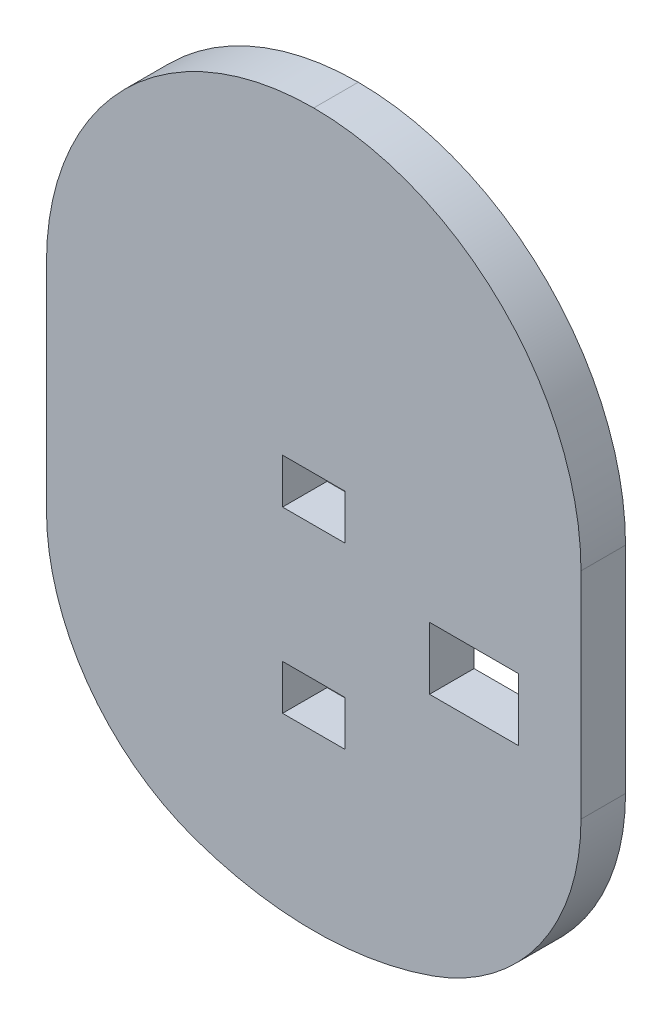
ISO-10303-21;
HEADER;
FILE_DESCRIPTION(('STEP AP214'),'2;1');
FILE_NAME('part.step','',(''),(''),'','','');
FILE_SCHEMA(('AUTOMOTIVE_DESIGN { 1 0 10303 214 1 1 1 1 }'));
ENDSEC;
DATA;
#1=APPLICATION_CONTEXT('core data for automotive mechanical design processes');
#2=APPLICATION_PROTOCOL_DEFINITION('international standard','automotive_design',2000,#1);
#3=PRODUCT_CONTEXT('',#1,'mechanical');
#4=PRODUCT('Part','Part','',(#3));
#5=PRODUCT_RELATED_PRODUCT_CATEGORY('part','',(#4));
#6=PRODUCT_DEFINITION_FORMATION('','',#4);
#7=PRODUCT_DEFINITION_CONTEXT('part definition',#1,'design');
#8=PRODUCT_DEFINITION('design','',#6,#7);
#9=PRODUCT_DEFINITION_SHAPE('','',#8);
#10=(LENGTH_UNIT() NAMED_UNIT(*) SI_UNIT(.MILLI.,.METRE.));
#11=(NAMED_UNIT(*) PLANE_ANGLE_UNIT() SI_UNIT($,.RADIAN.));
#12=(NAMED_UNIT(*) SI_UNIT($,.STERADIAN.) SOLID_ANGLE_UNIT());
#13=UNCERTAINTY_MEASURE_WITH_UNIT(LENGTH_MEASURE(1.E-05),#10,'distance_accuracy_value','');
#14=(GEOMETRIC_REPRESENTATION_CONTEXT(3) GLOBAL_UNCERTAINTY_ASSIGNED_CONTEXT((#13)) GLOBAL_UNIT_ASSIGNED_CONTEXT((#10,
#11,#12)) REPRESENTATION_CONTEXT('',''));
#15=CARTESIAN_POINT('',(0.,0.,0.));
#16=DIRECTION('',(0.,0.,1.));
#17=DIRECTION('',(1.,0.,0.));
#18=AXIS2_PLACEMENT_3D('',#15,#16,#17);
#19=CARTESIAN_POINT('',(0.,0.,5.));
#20=DIRECTION('',(0.,0.,-1.));
#21=DIRECTION('',(-1.,0.,0.));
#22=AXIS2_PLACEMENT_3D('',#19,#20,#21);
#23=CYLINDRICAL_SURFACE('',#22,40.);
#24=CARTESIAN_POINT('',(0.,0.,5.));
#25=DIRECTION('',(0.,0.,1.));
#26=DIRECTION('',(1.,0.,0.));
#27=AXIS2_PLACEMENT_3D('',#24,#25,#26);
#28=CIRCLE('',#27,40.);
#29=CARTESIAN_POINT('',(-13.3333333333333,-37.7123616632825,5.));
#30=VERTEX_POINT('',#29);
#31=CARTESIAN_POINT('',(13.3333333333333,-37.7123616632825,5.));
#32=VERTEX_POINT('',#31);
#33=EDGE_CURVE('E248',#30,#32,#28,.T.);
#34=ORIENTED_EDGE('',*,*,#33,.F.);
#35=DIRECTION('',(0.,0.,-1.));
#36=VECTOR('',#35,1.);
#37=CARTESIAN_POINT('',(-13.3333333333333,-37.7123616632825,5.));
#38=LINE('',#37,#36);
#39=CARTESIAN_POINT('',(-13.3333333333333,-37.7123616632825,0.));
#40=VERTEX_POINT('',#39);
#41=EDGE_CURVE('E284',#30,#40,#38,.T.);
#42=ORIENTED_EDGE('',*,*,#41,.T.);
#43=CARTESIAN_POINT('',(0.,0.,0.));
#44=DIRECTION('',(0.,0.,1.));
#45=DIRECTION('',(1.,0.,0.));
#46=AXIS2_PLACEMENT_3D('',#43,#44,#45);
#47=CIRCLE('',#46,40.);
#48=CARTESIAN_POINT('',(13.3333333333333,-37.7123616632825,0.));
#49=VERTEX_POINT('',#48);
#50=EDGE_CURVE('E244',#40,#49,#47,.T.);
#51=ORIENTED_EDGE('',*,*,#50,.T.);
#52=DIRECTION('',(0.,0.,-1.));
#53=VECTOR('',#52,1.);
#54=CARTESIAN_POINT('',(13.3333333333333,-37.7123616632825,5.));
#55=LINE('',#54,#53);
#56=EDGE_CURVE('E281',#49,#32,#55,.F.);
#57=ORIENTED_EDGE('',*,*,#56,.T.);
#58=EDGE_LOOP('',(#34,#42,#51,#57));
#59=FACE_BOUND('',#58,.T.);
#60=ADVANCED_FACE('F35',(#59),#23,.T.);
#61=CARTESIAN_POINT('',(0.,0.,5.));
#62=DIRECTION('',(0.,0.,1.));
#63=DIRECTION('',(1.,0.,0.));
#64=AXIS2_PLACEMENT_3D('',#61,#62,#63);
#65=PLANE('',#64);
#66=DIRECTION('',(0.,1.,0.));
#67=VECTOR('',#66,1.);
#68=CARTESIAN_POINT('',(23.,0.,5.));
#69=LINE('',#68,#67);
#70=CARTESIAN_POINT('',(23.,-10.5,5.));
#71=VERTEX_POINT('',#70);
#72=CARTESIAN_POINT('',(23.,-3.5,5.));
#73=VERTEX_POINT('',#72);
#74=EDGE_CURVE('E199',#71,#73,#69,.T.);
#75=ORIENTED_EDGE('',*,*,#74,.F.);
#76=DIRECTION('',(1.,0.,0.));
#77=VECTOR('',#76,1.);
#78=CARTESIAN_POINT('',(0.,-10.5,5.));
#79=LINE('',#78,#77);
#80=CARTESIAN_POINT('',(13.,-10.5,5.));
#81=VERTEX_POINT('',#80);
#82=EDGE_CURVE('E192',#81,#71,#79,.T.);
#83=ORIENTED_EDGE('',*,*,#82,.F.);
#84=DIRECTION('',(0.,-1.,0.));
#85=VECTOR('',#84,1.);
#86=CARTESIAN_POINT('',(13.,0.,5.));
#87=LINE('',#86,#85);
#88=CARTESIAN_POINT('',(13.,-3.5,5.));
#89=VERTEX_POINT('',#88);
#90=EDGE_CURVE('E172',#89,#81,#87,.T.);
#91=ORIENTED_EDGE('',*,*,#90,.F.);
#92=DIRECTION('',(-1.,0.,0.));
#93=VECTOR('',#92,1.);
#94=CARTESIAN_POINT('',(0.,-3.5,5.));
#95=LINE('',#94,#93);
#96=EDGE_CURVE('E197',#73,#89,#95,.T.);
#97=ORIENTED_EDGE('',*,*,#96,.F.);
#98=EDGE_LOOP('',(#75,#83,#91,#97));
#99=FACE_BOUND('',#98,.T.);
#100=DIRECTION('',(0.,1.,0.));
#101=VECTOR('',#100,1.);
#102=CARTESIAN_POINT('',(3.5,4.5,5.));
#103=LINE('',#102,#101);
#104=CARTESIAN_POINT('',(3.5,-0.549999999999996,5.));
#105=VERTEX_POINT('',#104);
#106=CARTESIAN_POINT('',(3.5,4.5,5.));
#107=VERTEX_POINT('',#106);
#108=EDGE_CURVE('E202',#105,#107,#103,.T.);
#109=ORIENTED_EDGE('',*,*,#108,.F.);
#110=DIRECTION('',(1.,0.,0.));
#111=VECTOR('',#110,1.);
#112=CARTESIAN_POINT('',(-3.5,-0.549999999999996,5.));
#113=LINE('',#112,#111);
#114=CARTESIAN_POINT('',(-3.5,-0.549999999999996,5.));
#115=VERTEX_POINT('',#114);
#116=EDGE_CURVE('E211',#115,#105,#113,.T.);
#117=ORIENTED_EDGE('',*,*,#116,.F.);
#118=DIRECTION('',(0.,-1.,0.));
#119=VECTOR('',#118,1.);
#120=CARTESIAN_POINT('',(-3.5,4.5,5.));
#121=LINE('',#120,#119);
#122=CARTESIAN_POINT('',(-3.5,4.5,5.));
#123=VERTEX_POINT('',#122);
#124=EDGE_CURVE('E208',#123,#115,#121,.T.);
#125=ORIENTED_EDGE('',*,*,#124,.F.);
#126=DIRECTION('',(-1.,0.,0.));
#127=VECTOR('',#126,1.);
#128=CARTESIAN_POINT('',(-3.5,4.5,5.));
#129=LINE('',#128,#127);
#130=EDGE_CURVE('E204',#107,#123,#129,.T.);
#131=ORIENTED_EDGE('',*,*,#130,.F.);
#132=EDGE_LOOP('',(#109,#117,#125,#131));
#133=FACE_BOUND('',#132,.T.);
#134=DIRECTION('',(0.,1.,0.));
#135=VECTOR('',#134,1.);
#136=CARTESIAN_POINT('',(3.5,-15.55,5.));
#137=LINE('',#136,#135);
#138=CARTESIAN_POINT('',(3.5,-20.6,5.));
#139=VERTEX_POINT('',#138);
#140=CARTESIAN_POINT('',(3.5,-15.55,5.));
#141=VERTEX_POINT('',#140);
#142=EDGE_CURVE('E201',#139,#141,#137,.T.);
#143=ORIENTED_EDGE('',*,*,#142,.F.);
#144=DIRECTION('',(1.,0.,0.));
#145=VECTOR('',#144,1.);
#146=CARTESIAN_POINT('',(-3.5,-20.6,5.));
#147=LINE('',#146,#145);
#148=CARTESIAN_POINT('',(-3.5,-20.6,5.));
#149=VERTEX_POINT('',#148);
#150=EDGE_CURVE('E231',#149,#139,#147,.T.);
#151=ORIENTED_EDGE('',*,*,#150,.F.);
#152=DIRECTION('',(0.,-1.,0.));
#153=VECTOR('',#152,1.);
#154=CARTESIAN_POINT('',(-3.5,-15.55,5.));
#155=LINE('',#154,#153);
#156=CARTESIAN_POINT('',(-3.5,-15.55,5.));
#157=VERTEX_POINT('',#156);
#158=EDGE_CURVE('E228',#157,#149,#155,.T.);
#159=ORIENTED_EDGE('',*,*,#158,.F.);
#160=DIRECTION('',(-1.,0.,0.));
#161=VECTOR('',#160,1.);
#162=CARTESIAN_POINT('',(-3.5,-15.55,5.));
#163=LINE('',#162,#161);
#164=EDGE_CURVE('E225',#141,#157,#163,.T.);
#165=ORIENTED_EDGE('',*,*,#164,.F.);
#166=EDGE_LOOP('',(#143,#151,#159,#165));
#167=FACE_BOUND('',#166,.T.);
#168=DIRECTION('',(0.,1.,0.));
#169=VECTOR('',#168,1.);
#170=CARTESIAN_POINT('',(-30.,26.4575131106459,5.));
#171=LINE('',#170,#169);
#172=CARTESIAN_POINT('',(-30.,-14.1421356237309,5.));
#173=VERTEX_POINT('',#172);
#174=CARTESIAN_POINT('',(-30.,10.,5.));
#175=VERTEX_POINT('',#174);
#176=EDGE_CURVE('E242',#173,#175,#171,.T.);
#177=ORIENTED_EDGE('',*,*,#176,.F.);
#178=CARTESIAN_POINT('',(-5.,-14.142135623731,5.));
#179=DIRECTION('',(0.,0.,1.));
#180=DIRECTION('',(1.,0.,0.));
#181=AXIS2_PLACEMENT_3D('',#178,#179,#180);
#182=CIRCLE('',#181,25.);
#183=EDGE_CURVE('E279',#173,#30,#182,.T.);
#184=ORIENTED_EDGE('',*,*,#183,.T.);
#185=ORIENTED_EDGE('',*,*,#33,.T.);
#186=CARTESIAN_POINT('',(5.,-14.142135623731,5.));
#187=DIRECTION('',(0.,0.,1.));
#188=DIRECTION('',(1.,0.,0.));
#189=AXIS2_PLACEMENT_3D('',#186,#187,#188);
#190=CIRCLE('',#189,25.);
#191=CARTESIAN_POINT('',(30.,-14.1421356237309,5.));
#192=VERTEX_POINT('',#191);
#193=EDGE_CURVE('E277',#32,#192,#190,.T.);
#194=ORIENTED_EDGE('',*,*,#193,.T.);
#195=DIRECTION('',(0.,-1.,0.));
#196=VECTOR('',#195,1.);
#197=CARTESIAN_POINT('',(30.,26.4575131106459,5.));
#198=LINE('',#197,#196);
#199=CARTESIAN_POINT('',(30.,10.,5.));
#200=VERTEX_POINT('',#199);
#201=EDGE_CURVE('E245',#200,#192,#198,.T.);
#202=ORIENTED_EDGE('',*,*,#201,.F.);
#203=CARTESIAN_POINT('',(0.,10.,5.));
#204=DIRECTION('',(0.,0.,1.));
#205=DIRECTION('',(1.,0.,0.));
#206=AXIS2_PLACEMENT_3D('',#203,#204,#205);
#207=CIRCLE('',#206,30.);
#208=CARTESIAN_POINT('',(0.,40.,5.));
#209=VERTEX_POINT('',#208);
#210=EDGE_CURVE('E258',#200,#209,#207,.T.);
#211=ORIENTED_EDGE('',*,*,#210,.T.);
#212=CARTESIAN_POINT('',(0.,10.,5.));
#213=DIRECTION('',(0.,0.,1.));
#214=DIRECTION('',(1.,0.,0.));
#215=AXIS2_PLACEMENT_3D('',#212,#213,#214);
#216=CIRCLE('',#215,30.);
#217=EDGE_CURVE('E260',#209,#175,#216,.T.);
#218=ORIENTED_EDGE('',*,*,#217,.T.);
#219=EDGE_LOOP('',(#177,#184,#185,#194,#202,#211,#218));
#220=FACE_BOUND('',#219,.T.);
#221=ADVANCED_FACE('F323',(#99,#133,#167,#220),#65,.T.);
#222=CARTESIAN_POINT('',(0.,0.,0.));
#223=DIRECTION('',(0.,0.,1.));
#224=DIRECTION('',(1.,0.,0.));
#225=AXIS2_PLACEMENT_3D('',#222,#223,#224);
#226=PLANE('',#225);
#227=CARTESIAN_POINT('',(17.5,20.,0.));
#228=DIRECTION('',(0.,0.,-1.));
#229=DIRECTION('',(-1.,0.,0.));
#230=AXIS2_PLACEMENT_3D('',#227,#228,#229);
#231=CIRCLE('',#230,8.5);
#232=CARTESIAN_POINT('',(9.,20.,0.));
#233=VERTEX_POINT('',#232);
#234=EDGE_CURVE('E483',#233,#233,#231,.T.);
#235=ORIENTED_EDGE('',*,*,#234,.F.);
#236=EDGE_LOOP('',(#235));
#237=FACE_BOUND('',#236,.T.);
#238=CARTESIAN_POINT('',(17.5,-20.,0.));
#239=DIRECTION('',(0.,0.,-1.));
#240=DIRECTION('',(-1.,0.,0.));
#241=AXIS2_PLACEMENT_3D('',#238,#239,#240);
#242=CIRCLE('',#241,8.5);
#243=CARTESIAN_POINT('',(9.,-20.,0.));
#244=VERTEX_POINT('',#243);
#245=EDGE_CURVE('E475',#244,#244,#242,.T.);
#246=ORIENTED_EDGE('',*,*,#245,.F.);
#247=EDGE_LOOP('',(#246));
#248=FACE_BOUND('',#247,.T.);
#249=CARTESIAN_POINT('',(-17.5,-20.,0.));
#250=DIRECTION('',(0.,0.,-1.));
#251=DIRECTION('',(-1.,0.,0.));
#252=AXIS2_PLACEMENT_3D('',#249,#250,#251);
#253=CIRCLE('',#252,8.5);
#254=CARTESIAN_POINT('',(-26.,-20.,0.));
#255=VERTEX_POINT('',#254);
#256=EDGE_CURVE('E468',#255,#255,#253,.T.);
#257=ORIENTED_EDGE('',*,*,#256,.F.);
#258=EDGE_LOOP('',(#257));
#259=FACE_BOUND('',#258,.T.);
#260=CARTESIAN_POINT('',(-17.5,20.,0.));
#261=DIRECTION('',(0.,0.,-1.));
#262=DIRECTION('',(-1.,0.,0.));
#263=AXIS2_PLACEMENT_3D('',#260,#261,#262);
#264=CIRCLE('',#263,8.5);
#265=CARTESIAN_POINT('',(-26.,20.,0.));
#266=VERTEX_POINT('',#265);
#267=EDGE_CURVE('E470',#266,#266,#264,.T.);
#268=ORIENTED_EDGE('',*,*,#267,.F.);
#269=EDGE_LOOP('',(#268));
#270=FACE_BOUND('',#269,.T.);
#271=DIRECTION('',(-1.,0.,0.));
#272=VECTOR('',#271,1.);
#273=CARTESIAN_POINT('',(23.,-10.5,0.));
#274=LINE('',#273,#272);
#275=CARTESIAN_POINT('',(23.,-10.5,0.));
#276=VERTEX_POINT('',#275);
#277=CARTESIAN_POINT('',(13.,-10.5,0.));
#278=VERTEX_POINT('',#277);
#279=EDGE_CURVE('E178',#276,#278,#274,.T.);
#280=ORIENTED_EDGE('',*,*,#279,.F.);
#281=DIRECTION('',(0.,-1.,0.));
#282=VECTOR('',#281,1.);
#283=CARTESIAN_POINT('',(23.,-3.5,0.));
#284=LINE('',#283,#282);
#285=CARTESIAN_POINT('',(23.,-3.5,0.));
#286=VERTEX_POINT('',#285);
#287=EDGE_CURVE('E58',#286,#276,#284,.T.);
#288=ORIENTED_EDGE('',*,*,#287,.F.);
#289=DIRECTION('',(1.,0.,0.));
#290=VECTOR('',#289,1.);
#291=CARTESIAN_POINT('',(23.,-3.5,0.));
#292=LINE('',#291,#290);
#293=CARTESIAN_POINT('',(13.,-3.5,0.));
#294=VERTEX_POINT('',#293);
#295=EDGE_CURVE('E185',#294,#286,#292,.T.);
#296=ORIENTED_EDGE('',*,*,#295,.F.);
#297=DIRECTION('',(0.,1.,0.));
#298=VECTOR('',#297,1.);
#299=CARTESIAN_POINT('',(13.,-3.5,0.));
#300=LINE('',#299,#298);
#301=EDGE_CURVE('E169',#278,#294,#300,.T.);
#302=ORIENTED_EDGE('',*,*,#301,.F.);
#303=EDGE_LOOP('',(#280,#288,#296,#302));
#304=FACE_BOUND('',#303,.T.);
#305=DIRECTION('',(1.,0.,0.));
#306=VECTOR('',#305,1.);
#307=CARTESIAN_POINT('',(0.,-0.549999999999996,0.));
#308=LINE('',#307,#306);
#309=CARTESIAN_POINT('',(-3.5,-0.549999999999996,0.));
#310=VERTEX_POINT('',#309);
#311=CARTESIAN_POINT('',(3.5,-0.549999999999996,0.));
#312=VERTEX_POINT('',#311);
#313=EDGE_CURVE('E43',#310,#312,#308,.T.);
#314=ORIENTED_EDGE('',*,*,#313,.T.);
#315=DIRECTION('',(0.,1.,0.));
#316=VECTOR('',#315,1.);
#317=CARTESIAN_POINT('',(3.5,0.,0.));
#318=LINE('',#317,#316);
#319=CARTESIAN_POINT('',(3.5,4.5,0.));
#320=VERTEX_POINT('',#319);
#321=EDGE_CURVE('E11',#312,#320,#318,.T.);
#322=ORIENTED_EDGE('',*,*,#321,.T.);
#323=DIRECTION('',(-1.,0.,0.));
#324=VECTOR('',#323,1.);
#325=CARTESIAN_POINT('',(0.,4.5,0.));
#326=LINE('',#325,#324);
#327=CARTESIAN_POINT('',(-3.5,4.5,0.));
#328=VERTEX_POINT('',#327);
#329=EDGE_CURVE('E304',#320,#328,#326,.T.);
#330=ORIENTED_EDGE('',*,*,#329,.T.);
#331=DIRECTION('',(0.,-1.,0.));
#332=VECTOR('',#331,1.);
#333=CARTESIAN_POINT('',(-3.5,0.,0.));
#334=LINE('',#333,#332);
#335=EDGE_CURVE('E307',#328,#310,#334,.T.);
#336=ORIENTED_EDGE('',*,*,#335,.T.);
#337=EDGE_LOOP('',(#314,#322,#330,#336));
#338=FACE_BOUND('',#337,.T.);
#339=DIRECTION('',(1.,0.,0.));
#340=VECTOR('',#339,1.);
#341=CARTESIAN_POINT('',(0.,-20.6,0.));
#342=LINE('',#341,#340);
#343=CARTESIAN_POINT('',(-3.5,-20.6,0.));
#344=VERTEX_POINT('',#343);
#345=CARTESIAN_POINT('',(3.5,-20.6,0.));
#346=VERTEX_POINT('',#345);
#347=EDGE_CURVE('E298',#344,#346,#342,.T.);
#348=ORIENTED_EDGE('',*,*,#347,.T.);
#349=DIRECTION('',(0.,1.,0.));
#350=VECTOR('',#349,1.);
#351=CARTESIAN_POINT('',(3.50000000000001,0.,0.));
#352=LINE('',#351,#350);
#353=CARTESIAN_POINT('',(3.5,-15.55,0.));
#354=VERTEX_POINT('',#353);
#355=EDGE_CURVE('E301',#346,#354,#352,.T.);
#356=ORIENTED_EDGE('',*,*,#355,.T.);
#357=DIRECTION('',(-1.,0.,0.));
#358=VECTOR('',#357,1.);
#359=CARTESIAN_POINT('',(0.,-15.55,0.));
#360=LINE('',#359,#358);
#361=CARTESIAN_POINT('',(-3.5,-15.55,0.));
#362=VERTEX_POINT('',#361);
#363=EDGE_CURVE('E292',#354,#362,#360,.T.);
#364=ORIENTED_EDGE('',*,*,#363,.T.);
#365=DIRECTION('',(0.,-1.,0.));
#366=VECTOR('',#365,1.);
#367=CARTESIAN_POINT('',(-3.50000000000001,0.,0.));
#368=LINE('',#367,#366);
#369=EDGE_CURVE('E295',#362,#344,#368,.T.);
#370=ORIENTED_EDGE('',*,*,#369,.T.);
#371=EDGE_LOOP('',(#348,#356,#364,#370));
#372=FACE_BOUND('',#371,.T.);
#373=ORIENTED_EDGE('',*,*,#50,.F.);
#374=CARTESIAN_POINT('',(-5.,-14.142135623731,0.));
#375=DIRECTION('',(0.,0.,1.));
#376=DIRECTION('',(1.,0.,0.));
#377=AXIS2_PLACEMENT_3D('',#374,#375,#376);
#378=CIRCLE('',#377,25.);
#379=CARTESIAN_POINT('',(-30.,-14.142135623731,0.));
#380=VERTEX_POINT('',#379);
#381=EDGE_CURVE('E288',#40,#380,#378,.F.);
#382=ORIENTED_EDGE('',*,*,#381,.T.);
#383=DIRECTION('',(0.,1.,0.));
#384=VECTOR('',#383,1.);
#385=CARTESIAN_POINT('',(-30.,0.,0.));
#386=LINE('',#385,#384);
#387=CARTESIAN_POINT('',(-30.,10.,0.));
#388=VERTEX_POINT('',#387);
#389=EDGE_CURVE('E256',#380,#388,#386,.T.);
#390=ORIENTED_EDGE('',*,*,#389,.T.);
#391=CARTESIAN_POINT('',(0.,10.,0.));
#392=DIRECTION('',(0.,0.,1.));
#393=DIRECTION('',(1.,0.,0.));
#394=AXIS2_PLACEMENT_3D('',#391,#392,#393);
#395=CIRCLE('',#394,30.);
#396=CARTESIAN_POINT('',(0.,40.,0.));
#397=VERTEX_POINT('',#396);
#398=EDGE_CURVE('E268',#388,#397,#395,.F.);
#399=ORIENTED_EDGE('',*,*,#398,.T.);
#400=CARTESIAN_POINT('',(0.,10.,0.));
#401=DIRECTION('',(0.,0.,1.));
#402=DIRECTION('',(1.,0.,0.));
#403=AXIS2_PLACEMENT_3D('',#400,#401,#402);
#404=CIRCLE('',#403,30.);
#405=CARTESIAN_POINT('',(30.,10.,0.));
#406=VERTEX_POINT('',#405);
#407=EDGE_CURVE('E266',#397,#406,#404,.F.);
#408=ORIENTED_EDGE('',*,*,#407,.T.);
#409=DIRECTION('',(0.,-1.,0.));
#410=VECTOR('',#409,1.);
#411=CARTESIAN_POINT('',(30.,0.,0.));
#412=LINE('',#411,#410);
#413=CARTESIAN_POINT('',(30.,-14.142135623731,0.));
#414=VERTEX_POINT('',#413);
#415=EDGE_CURVE('E251',#406,#414,#412,.T.);
#416=ORIENTED_EDGE('',*,*,#415,.T.);
#417=CARTESIAN_POINT('',(5.,-14.142135623731,0.));
#418=DIRECTION('',(0.,0.,1.));
#419=DIRECTION('',(1.,0.,0.));
#420=AXIS2_PLACEMENT_3D('',#417,#418,#419);
#421=CIRCLE('',#420,25.);
#422=EDGE_CURVE('E286',#414,#49,#421,.F.);
#423=ORIENTED_EDGE('',*,*,#422,.T.);
#424=EDGE_LOOP('',(#373,#382,#390,#399,#408,#416,#423));
#425=FACE_BOUND('',#424,.T.);
#426=ADVANCED_FACE('F182',(#237,#248,#259,#270,#304,#338,#372,#425),#226,.F.);
#427=CARTESIAN_POINT('',(30.,26.4575131106459,-5.));
#428=DIRECTION('',(-1.,0.,0.));
#429=DIRECTION('',(0.,0.,1.));
#430=AXIS2_PLACEMENT_3D('',#427,#428,#429);
#431=PLANE('',#430);
#432=ORIENTED_EDGE('',*,*,#201,.T.);
#433=DIRECTION('',(0.,0.,-1.));
#434=VECTOR('',#433,1.);
#435=CARTESIAN_POINT('',(30.,-14.1421356237309,-5.));
#436=LINE('',#435,#434);
#437=EDGE_CURVE('E290',#192,#414,#436,.T.);
#438=ORIENTED_EDGE('',*,*,#437,.T.);
#439=ORIENTED_EDGE('',*,*,#415,.F.);
#440=DIRECTION('',(0.,0.,-1.));
#441=VECTOR('',#440,1.);
#442=CARTESIAN_POINT('',(30.,10.,-5.));
#443=LINE('',#442,#441);
#444=EDGE_CURVE('E270',#406,#200,#443,.F.);
#445=ORIENTED_EDGE('',*,*,#444,.T.);
#446=EDGE_LOOP('',(#432,#438,#439,#445));
#447=FACE_BOUND('',#446,.T.);
#448=ADVANCED_FACE('F386',(#447),#431,.F.);
#449=CARTESIAN_POINT('',(-30.,26.4575131106459,-5.));
#450=DIRECTION('',(1.,0.,0.));
#451=DIRECTION('',(0.,0.,-1.));
#452=AXIS2_PLACEMENT_3D('',#449,#450,#451);
#453=PLANE('',#452);
#454=ORIENTED_EDGE('',*,*,#389,.F.);
#455=DIRECTION('',(0.,0.,-1.));
#456=VECTOR('',#455,1.);
#457=CARTESIAN_POINT('',(-30.,-14.1421356237309,-5.));
#458=LINE('',#457,#456);
#459=EDGE_CURVE('E272',#380,#173,#458,.F.);
#460=ORIENTED_EDGE('',*,*,#459,.T.);
#461=ORIENTED_EDGE('',*,*,#176,.T.);
#462=DIRECTION('',(0.,0.,-1.));
#463=VECTOR('',#462,1.);
#464=CARTESIAN_POINT('',(-30.,10.,-5.));
#465=LINE('',#464,#463);
#466=EDGE_CURVE('E263',#175,#388,#465,.T.);
#467=ORIENTED_EDGE('',*,*,#466,.T.);
#468=EDGE_LOOP('',(#454,#460,#461,#467));
#469=FACE_BOUND('',#468,.T.);
#470=ADVANCED_FACE('F359',(#469),#453,.F.);
#471=CARTESIAN_POINT('',(0.,10.,5.));
#472=DIRECTION('',(0.,0.,-1.));
#473=DIRECTION('',(-1.,0.,0.));
#474=AXIS2_PLACEMENT_3D('',#471,#472,#473);
#475=CYLINDRICAL_SURFACE('',#474,30.);
#476=ORIENTED_EDGE('',*,*,#444,.F.);
#477=ORIENTED_EDGE('',*,*,#407,.F.);
#478=DIRECTION('',(0.,0.,-1.));
#479=VECTOR('',#478,1.);
#480=CARTESIAN_POINT('',(0.,40.,5.));
#481=LINE('',#480,#479);
#482=EDGE_CURVE('E217',#209,#397,#481,.T.);
#483=ORIENTED_EDGE('',*,*,#482,.F.);
#484=ORIENTED_EDGE('',*,*,#210,.F.);
#485=EDGE_LOOP('',(#476,#477,#483,#484));
#486=FACE_BOUND('',#485,.T.);
#487=ADVANCED_FACE('F356',(#486),#475,.T.);
#488=CARTESIAN_POINT('',(0.,10.,5.));
#489=DIRECTION('',(0.,0.,-1.));
#490=DIRECTION('',(-1.,0.,0.));
#491=AXIS2_PLACEMENT_3D('',#488,#489,#490);
#492=CYLINDRICAL_SURFACE('',#491,30.);
#493=ORIENTED_EDGE('',*,*,#398,.F.);
#494=ORIENTED_EDGE('',*,*,#466,.F.);
#495=ORIENTED_EDGE('',*,*,#217,.F.);
#496=ORIENTED_EDGE('',*,*,#482,.T.);
#497=EDGE_LOOP('',(#493,#494,#495,#496));
#498=FACE_BOUND('',#497,.T.);
#499=ADVANCED_FACE('F352',(#498),#492,.T.);
#500=CARTESIAN_POINT('',(-5.,-14.142135623731,5.));
#501=DIRECTION('',(0.,0.,-1.));
#502=DIRECTION('',(-1.,0.,0.));
#503=AXIS2_PLACEMENT_3D('',#500,#501,#502);
#504=CYLINDRICAL_SURFACE('',#503,25.);
#505=ORIENTED_EDGE('',*,*,#381,.F.);
#506=ORIENTED_EDGE('',*,*,#41,.F.);
#507=ORIENTED_EDGE('',*,*,#183,.F.);
#508=ORIENTED_EDGE('',*,*,#459,.F.);
#509=EDGE_LOOP('',(#505,#506,#507,#508));
#510=FACE_BOUND('',#509,.T.);
#511=ADVANCED_FACE('F355',(#510),#504,.T.);
#512=CARTESIAN_POINT('',(5.,-14.142135623731,5.));
#513=DIRECTION('',(0.,0.,-1.));
#514=DIRECTION('',(-1.,0.,0.));
#515=AXIS2_PLACEMENT_3D('',#512,#513,#514);
#516=CYLINDRICAL_SURFACE('',#515,25.);
#517=ORIENTED_EDGE('',*,*,#422,.F.);
#518=ORIENTED_EDGE('',*,*,#437,.F.);
#519=ORIENTED_EDGE('',*,*,#193,.F.);
#520=ORIENTED_EDGE('',*,*,#56,.F.);
#521=EDGE_LOOP('',(#517,#518,#519,#520));
#522=FACE_BOUND('',#521,.T.);
#523=ADVANCED_FACE('F37',(#522),#516,.T.);
#524=CARTESIAN_POINT('',(3.5,-15.55,-5.));
#525=DIRECTION('',(1.,0.,0.));
#526=DIRECTION('',(0.,1.,0.));
#527=AXIS2_PLACEMENT_3D('',#524,#525,#526);
#528=PLANE('',#527);
#529=DIRECTION('',(0.,0.,1.));
#530=VECTOR('',#529,1.);
#531=CARTESIAN_POINT('',(3.5,-20.6,-5.));
#532=LINE('',#531,#530);
#533=EDGE_CURVE('E205',#346,#139,#532,.T.);
#534=ORIENTED_EDGE('',*,*,#533,.T.);
#535=ORIENTED_EDGE('',*,*,#142,.T.);
#536=DIRECTION('',(0.,0.,1.));
#537=VECTOR('',#536,1.);
#538=CARTESIAN_POINT('',(3.5,-15.55,-5.));
#539=LINE('',#538,#537);
#540=EDGE_CURVE('E234',#354,#141,#539,.T.);
#541=ORIENTED_EDGE('',*,*,#540,.F.);
#542=ORIENTED_EDGE('',*,*,#355,.F.);
#543=EDGE_LOOP('',(#534,#535,#541,#542));
#544=FACE_BOUND('',#543,.T.);
#545=ADVANCED_FACE('F366',(#544),#528,.F.);
#546=CARTESIAN_POINT('',(-3.5,-20.6,-5.));
#547=DIRECTION('',(0.,-1.,0.));
#548=DIRECTION('',(0.,0.,-1.));
#549=AXIS2_PLACEMENT_3D('',#546,#547,#548);
#550=PLANE('',#549);
#551=DIRECTION('',(0.,0.,1.));
#552=VECTOR('',#551,1.);
#553=CARTESIAN_POINT('',(-3.5,-20.6,-5.));
#554=LINE('',#553,#552);
#555=EDGE_CURVE('E236',#344,#149,#554,.T.);
#556=ORIENTED_EDGE('',*,*,#555,.T.);
#557=ORIENTED_EDGE('',*,*,#150,.T.);
#558=ORIENTED_EDGE('',*,*,#533,.F.);
#559=ORIENTED_EDGE('',*,*,#347,.F.);
#560=EDGE_LOOP('',(#556,#557,#558,#559));
#561=FACE_BOUND('',#560,.T.);
#562=ADVANCED_FACE('F402',(#561),#550,.F.);
#563=CARTESIAN_POINT('',(-3.5,-15.55,-5.));
#564=DIRECTION('',(-1.,0.,0.));
#565=DIRECTION('',(0.,-1.,0.));
#566=AXIS2_PLACEMENT_3D('',#563,#564,#565);
#567=PLANE('',#566);
#568=DIRECTION('',(0.,0.,1.));
#569=VECTOR('',#568,1.);
#570=CARTESIAN_POINT('',(-3.5,-15.55,-5.));
#571=LINE('',#570,#569);
#572=EDGE_CURVE('E238',#362,#157,#571,.T.);
#573=ORIENTED_EDGE('',*,*,#572,.T.);
#574=ORIENTED_EDGE('',*,*,#158,.T.);
#575=ORIENTED_EDGE('',*,*,#555,.F.);
#576=ORIENTED_EDGE('',*,*,#369,.F.);
#577=EDGE_LOOP('',(#573,#574,#575,#576));
#578=FACE_BOUND('',#577,.T.);
#579=ADVANCED_FACE('F407',(#578),#567,.F.);
#580=CARTESIAN_POINT('',(-3.5,-15.55,-5.));
#581=DIRECTION('',(0.,1.,0.));
#582=DIRECTION('',(0.,0.,1.));
#583=AXIS2_PLACEMENT_3D('',#580,#581,#582);
#584=PLANE('',#583);
#585=ORIENTED_EDGE('',*,*,#540,.T.);
#586=ORIENTED_EDGE('',*,*,#164,.T.);
#587=ORIENTED_EDGE('',*,*,#572,.F.);
#588=ORIENTED_EDGE('',*,*,#363,.F.);
#589=EDGE_LOOP('',(#585,#586,#587,#588));
#590=FACE_BOUND('',#589,.T.);
#591=ADVANCED_FACE('F404',(#590),#584,.F.);
#592=CARTESIAN_POINT('',(3.5,4.5,-5.));
#593=DIRECTION('',(1.,0.,0.));
#594=DIRECTION('',(0.,0.,-1.));
#595=AXIS2_PLACEMENT_3D('',#592,#593,#594);
#596=PLANE('',#595);
#597=DIRECTION('',(0.,0.,1.));
#598=VECTOR('',#597,1.);
#599=CARTESIAN_POINT('',(3.5,-0.549999999999996,-5.));
#600=LINE('',#599,#598);
#601=EDGE_CURVE('E215',#312,#105,#600,.T.);
#602=ORIENTED_EDGE('',*,*,#601,.T.);
#603=ORIENTED_EDGE('',*,*,#108,.T.);
#604=DIRECTION('',(0.,0.,1.));
#605=VECTOR('',#604,1.);
#606=CARTESIAN_POINT('',(3.5,4.5,-5.));
#607=LINE('',#606,#605);
#608=EDGE_CURVE('E214',#320,#107,#607,.T.);
#609=ORIENTED_EDGE('',*,*,#608,.F.);
#610=ORIENTED_EDGE('',*,*,#321,.F.);
#611=EDGE_LOOP('',(#602,#603,#609,#610));
#612=FACE_BOUND('',#611,.T.);
#613=ADVANCED_FACE('F327',(#612),#596,.F.);
#614=CARTESIAN_POINT('',(-3.5,-0.549999999999996,-5.));
#615=DIRECTION('',(0.,-1.,0.));
#616=DIRECTION('',(0.,0.,-1.));
#617=AXIS2_PLACEMENT_3D('',#614,#615,#616);
#618=PLANE('',#617);
#619=DIRECTION('',(0.,0.,1.));
#620=VECTOR('',#619,1.);
#621=CARTESIAN_POINT('',(-3.5,-0.549999999999996,-5.));
#622=LINE('',#621,#620);
#623=EDGE_CURVE('E218',#310,#115,#622,.T.);
#624=ORIENTED_EDGE('',*,*,#623,.T.);
#625=ORIENTED_EDGE('',*,*,#116,.T.);
#626=ORIENTED_EDGE('',*,*,#601,.F.);
#627=ORIENTED_EDGE('',*,*,#313,.F.);
#628=EDGE_LOOP('',(#624,#625,#626,#627));
#629=FACE_BOUND('',#628,.T.);
#630=ADVANCED_FACE('F315',(#629),#618,.F.);
#631=CARTESIAN_POINT('',(-3.5,4.5,-5.));
#632=DIRECTION('',(-1.,0.,0.));
#633=DIRECTION('',(0.,0.,1.));
#634=AXIS2_PLACEMENT_3D('',#631,#632,#633);
#635=PLANE('',#634);
#636=DIRECTION('',(0.,0.,1.));
#637=VECTOR('',#636,1.);
#638=CARTESIAN_POINT('',(-3.5,4.5,-5.));
#639=LINE('',#638,#637);
#640=EDGE_CURVE('E220',#328,#123,#639,.T.);
#641=ORIENTED_EDGE('',*,*,#640,.T.);
#642=ORIENTED_EDGE('',*,*,#124,.T.);
#643=ORIENTED_EDGE('',*,*,#623,.F.);
#644=ORIENTED_EDGE('',*,*,#335,.F.);
#645=EDGE_LOOP('',(#641,#642,#643,#644));
#646=FACE_BOUND('',#645,.T.);
#647=ADVANCED_FACE('F317',(#646),#635,.F.);
#648=CARTESIAN_POINT('',(-3.5,4.5,-5.));
#649=DIRECTION('',(0.,1.,0.));
#650=DIRECTION('',(0.,0.,1.));
#651=AXIS2_PLACEMENT_3D('',#648,#649,#650);
#652=PLANE('',#651);
#653=ORIENTED_EDGE('',*,*,#608,.T.);
#654=ORIENTED_EDGE('',*,*,#130,.T.);
#655=ORIENTED_EDGE('',*,*,#640,.F.);
#656=ORIENTED_EDGE('',*,*,#329,.F.);
#657=EDGE_LOOP('',(#653,#654,#655,#656));
#658=FACE_BOUND('',#657,.T.);
#659=ADVANCED_FACE('F329',(#658),#652,.F.);
#660=CARTESIAN_POINT('',(23.,-3.5,10.));
#661=DIRECTION('',(1.,0.,0.));
#662=DIRECTION('',(0.,0.,-1.));
#663=AXIS2_PLACEMENT_3D('',#660,#661,#662);
#664=PLANE('',#663);
#665=ORIENTED_EDGE('',*,*,#74,.T.);
#666=DIRECTION('',(0.,0.,-1.));
#667=VECTOR('',#666,1.);
#668=CARTESIAN_POINT('',(23.,-3.5,10.));
#669=LINE('',#668,#667);
#670=EDGE_CURVE('E190',#73,#286,#669,.T.);
#671=ORIENTED_EDGE('',*,*,#670,.T.);
#672=ORIENTED_EDGE('',*,*,#287,.T.);
#673=DIRECTION('',(0.,0.,-1.));
#674=VECTOR('',#673,1.);
#675=CARTESIAN_POINT('',(23.,-10.5,10.));
#676=LINE('',#675,#674);
#677=EDGE_CURVE('E175',#71,#276,#676,.T.);
#678=ORIENTED_EDGE('',*,*,#677,.F.);
#679=EDGE_LOOP('',(#665,#671,#672,#678));
#680=FACE_BOUND('',#679,.T.);
#681=ADVANCED_FACE('F331',(#680),#664,.F.);
#682=CARTESIAN_POINT('',(23.,-3.5,10.));
#683=DIRECTION('',(0.,1.,0.));
#684=DIRECTION('',(0.,0.,1.));
#685=AXIS2_PLACEMENT_3D('',#682,#683,#684);
#686=PLANE('',#685);
#687=ORIENTED_EDGE('',*,*,#96,.T.);
#688=DIRECTION('',(0.,0.,-1.));
#689=VECTOR('',#688,1.);
#690=CARTESIAN_POINT('',(13.,-3.5,10.));
#691=LINE('',#690,#689);
#692=EDGE_CURVE('E174',#89,#294,#691,.T.);
#693=ORIENTED_EDGE('',*,*,#692,.T.);
#694=ORIENTED_EDGE('',*,*,#295,.T.);
#695=ORIENTED_EDGE('',*,*,#670,.F.);
#696=EDGE_LOOP('',(#687,#693,#694,#695));
#697=FACE_BOUND('',#696,.T.);
#698=ADVANCED_FACE('F337',(#697),#686,.F.);
#699=CARTESIAN_POINT('',(13.,-3.5,10.));
#700=DIRECTION('',(-1.,0.,0.));
#701=DIRECTION('',(0.,-1.,0.));
#702=AXIS2_PLACEMENT_3D('',#699,#700,#701);
#703=PLANE('',#702);
#704=ORIENTED_EDGE('',*,*,#90,.T.);
#705=DIRECTION('',(0.,0.,-1.));
#706=VECTOR('',#705,1.);
#707=CARTESIAN_POINT('',(13.,-10.5,10.));
#708=LINE('',#707,#706);
#709=EDGE_CURVE('E50',#81,#278,#708,.T.);
#710=ORIENTED_EDGE('',*,*,#709,.T.);
#711=ORIENTED_EDGE('',*,*,#301,.T.);
#712=ORIENTED_EDGE('',*,*,#692,.F.);
#713=EDGE_LOOP('',(#704,#710,#711,#712));
#714=FACE_BOUND('',#713,.T.);
#715=ADVANCED_FACE('F166',(#714),#703,.F.);
#716=CARTESIAN_POINT('',(23.,-10.5,10.));
#717=DIRECTION('',(0.,-1.,0.));
#718=DIRECTION('',(1.,0.,0.));
#719=AXIS2_PLACEMENT_3D('',#716,#717,#718);
#720=PLANE('',#719);
#721=ORIENTED_EDGE('',*,*,#82,.T.);
#722=ORIENTED_EDGE('',*,*,#677,.T.);
#723=ORIENTED_EDGE('',*,*,#279,.T.);
#724=ORIENTED_EDGE('',*,*,#709,.F.);
#725=EDGE_LOOP('',(#721,#722,#723,#724));
#726=FACE_BOUND('',#725,.T.);
#727=ADVANCED_FACE('F179',(#726),#720,.F.);
#728=CARTESIAN_POINT('',(-17.5,20.,1.));
#729=DIRECTION('',(0.,0.,-1.));
#730=DIRECTION('',(-1.,0.,0.));
#731=AXIS2_PLACEMENT_3D('',#728,#729,#730);
#732=CYLINDRICAL_SURFACE('',#731,8.5);
#733=CARTESIAN_POINT('',(-17.5,20.,1.));
#734=DIRECTION('',(0.,0.,-1.));
#735=DIRECTION('',(-1.,0.,0.));
#736=AXIS2_PLACEMENT_3D('',#733,#734,#735);
#737=CIRCLE('',#736,8.5);
#738=CARTESIAN_POINT('',(-26.,20.,1.));
#739=VERTEX_POINT('',#738);
#740=EDGE_CURVE('E473',#739,#739,#737,.T.);
#741=ORIENTED_EDGE('',*,*,#740,.F.);
#742=EDGE_LOOP('',(#741));
#743=FACE_BOUND('',#742,.T.);
#744=ORIENTED_EDGE('',*,*,#267,.T.);
#745=EDGE_LOOP('',(#744));
#746=FACE_BOUND('',#745,.T.);
#747=ADVANCED_FACE('F424',(#743,#746),#732,.F.);
#748=CARTESIAN_POINT('',(-17.5,20.,1.));
#749=DIRECTION('',(0.,0.,-1.));
#750=DIRECTION('',(-1.,0.,0.));
#751=AXIS2_PLACEMENT_3D('',#748,#749,#750);
#752=PLANE('',#751);
#753=ORIENTED_EDGE('',*,*,#740,.T.);
#754=EDGE_LOOP('',(#753));
#755=FACE_BOUND('',#754,.T.);
#756=ADVANCED_FACE('F432',(#755),#752,.T.);
#757=CARTESIAN_POINT('',(-17.5,-20.,1.));
#758=DIRECTION('',(0.,0.,-1.));
#759=DIRECTION('',(-1.,0.,0.));
#760=AXIS2_PLACEMENT_3D('',#757,#758,#759);
#761=CYLINDRICAL_SURFACE('',#760,8.5);
#762=CARTESIAN_POINT('',(-17.5,-20.,1.));
#763=DIRECTION('',(0.,0.,-1.));
#764=DIRECTION('',(-1.,0.,0.));
#765=AXIS2_PLACEMENT_3D('',#762,#763,#764);
#766=CIRCLE('',#765,8.5);
#767=CARTESIAN_POINT('',(-26.,-20.,1.));
#768=VERTEX_POINT('',#767);
#769=EDGE_CURVE('E465',#768,#768,#766,.T.);
#770=ORIENTED_EDGE('',*,*,#769,.F.);
#771=EDGE_LOOP('',(#770));
#772=FACE_BOUND('',#771,.T.);
#773=ORIENTED_EDGE('',*,*,#256,.T.);
#774=EDGE_LOOP('',(#773));
#775=FACE_BOUND('',#774,.T.);
#776=ADVANCED_FACE('F436',(#772,#775),#761,.F.);
#777=CARTESIAN_POINT('',(-17.5,-20.,1.));
#778=DIRECTION('',(0.,0.,-1.));
#779=DIRECTION('',(-1.,0.,0.));
#780=AXIS2_PLACEMENT_3D('',#777,#778,#779);
#781=PLANE('',#780);
#782=ORIENTED_EDGE('',*,*,#769,.T.);
#783=EDGE_LOOP('',(#782));
#784=FACE_BOUND('',#783,.T.);
#785=ADVANCED_FACE('F453',(#784),#781,.T.);
#786=CARTESIAN_POINT('',(17.5,-20.,1.));
#787=DIRECTION('',(0.,0.,-1.));
#788=DIRECTION('',(-1.,0.,0.));
#789=AXIS2_PLACEMENT_3D('',#786,#787,#788);
#790=CYLINDRICAL_SURFACE('',#789,8.5);
#791=CARTESIAN_POINT('',(17.5,-20.,1.));
#792=DIRECTION('',(0.,0.,-1.));
#793=DIRECTION('',(-1.,0.,0.));
#794=AXIS2_PLACEMENT_3D('',#791,#792,#793);
#795=CIRCLE('',#794,8.5);
#796=CARTESIAN_POINT('',(9.,-20.,1.));
#797=VERTEX_POINT('',#796);
#798=EDGE_CURVE('E480',#797,#797,#795,.T.);
#799=ORIENTED_EDGE('',*,*,#798,.F.);
#800=EDGE_LOOP('',(#799));
#801=FACE_BOUND('',#800,.T.);
#802=ORIENTED_EDGE('',*,*,#245,.T.);
#803=EDGE_LOOP('',(#802));
#804=FACE_BOUND('',#803,.T.);
#805=ADVANCED_FACE('F449',(#801,#804),#790,.F.);
#806=CARTESIAN_POINT('',(17.5,-20.,1.));
#807=DIRECTION('',(0.,0.,-1.));
#808=DIRECTION('',(-1.,0.,0.));
#809=AXIS2_PLACEMENT_3D('',#806,#807,#808);
#810=PLANE('',#809);
#811=ORIENTED_EDGE('',*,*,#798,.T.);
#812=EDGE_LOOP('',(#811));
#813=FACE_BOUND('',#812,.T.);
#814=ADVANCED_FACE('F445',(#813),#810,.T.);
#815=CARTESIAN_POINT('',(17.5,20.,1.));
#816=DIRECTION('',(0.,0.,-1.));
#817=DIRECTION('',(-1.,0.,0.));
#818=AXIS2_PLACEMENT_3D('',#815,#816,#817);
#819=CYLINDRICAL_SURFACE('',#818,8.5);
#820=CARTESIAN_POINT('',(17.5,20.,1.));
#821=DIRECTION('',(0.,0.,-1.));
#822=DIRECTION('',(-1.,0.,0.));
#823=AXIS2_PLACEMENT_3D('',#820,#821,#822);
#824=CIRCLE('',#823,8.5);
#825=CARTESIAN_POINT('',(9.,20.,1.));
#826=VERTEX_POINT('',#825);
#827=EDGE_CURVE('E486',#826,#826,#824,.T.);
#828=ORIENTED_EDGE('',*,*,#827,.F.);
#829=EDGE_LOOP('',(#828));
#830=FACE_BOUND('',#829,.T.);
#831=ORIENTED_EDGE('',*,*,#234,.T.);
#832=EDGE_LOOP('',(#831));
#833=FACE_BOUND('',#832,.T.);
#834=ADVANCED_FACE('F441',(#830,#833),#819,.F.);
#835=CARTESIAN_POINT('',(17.5,20.,1.));
#836=DIRECTION('',(0.,0.,-1.));
#837=DIRECTION('',(-1.,0.,0.));
#838=AXIS2_PLACEMENT_3D('',#835,#836,#837);
#839=PLANE('',#838);
#840=ORIENTED_EDGE('',*,*,#827,.T.);
#841=EDGE_LOOP('',(#840));
#842=FACE_BOUND('',#841,.T.);
#843=ADVANCED_FACE('F438',(#842),#839,.T.);
#844=CLOSED_SHELL('',(#60,#221,#426,#448,#470,#487,#499,#511,#523,#545,#562,#579,#591,#613,#630,
#647,#659,#681,#698,#715,#727,#747,#756,#776,#785,#805,#814,#834,#843));
#845=MANIFOLD_SOLID_BREP('B2',#844);
#846=ADVANCED_BREP_SHAPE_REPRESENTATION('',(#18,#845),#14);
#847=SHAPE_DEFINITION_REPRESENTATION(#9,#846);
ENDSEC;
END-ISO-10303-21;
